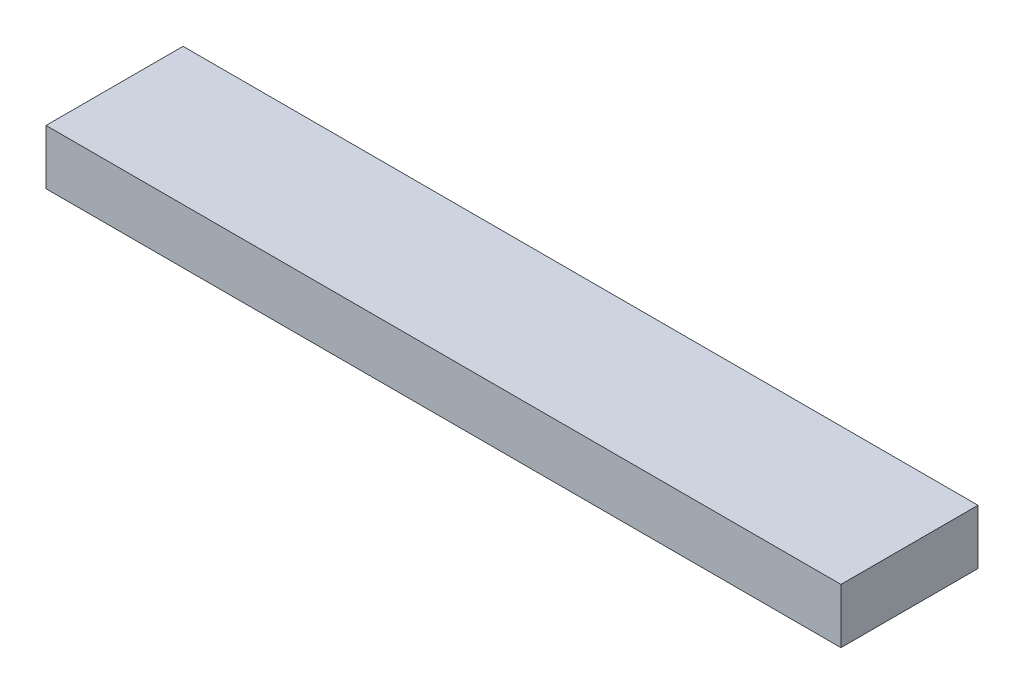
ISO-10303-21;
HEADER;
FILE_DESCRIPTION(('STEP AP214'),'2;1');
FILE_NAME('part.step','',(''),(''),'','','');
FILE_SCHEMA(('AUTOMOTIVE_DESIGN { 1 0 10303 214 1 1 1 1 }'));
ENDSEC;
DATA;
#1=APPLICATION_CONTEXT('core data for automotive mechanical design processes');
#2=APPLICATION_PROTOCOL_DEFINITION('international standard','automotive_design',2000,#1);
#3=PRODUCT_CONTEXT('',#1,'mechanical');
#4=PRODUCT('Part','Part','',(#3));
#5=PRODUCT_RELATED_PRODUCT_CATEGORY('part','',(#4));
#6=PRODUCT_DEFINITION_FORMATION('','',#4);
#7=PRODUCT_DEFINITION_CONTEXT('part definition',#1,'design');
#8=PRODUCT_DEFINITION('design','',#6,#7);
#9=PRODUCT_DEFINITION_SHAPE('','',#8);
#10=(LENGTH_UNIT() NAMED_UNIT(*) SI_UNIT(.MILLI.,.METRE.));
#11=(NAMED_UNIT(*) PLANE_ANGLE_UNIT() SI_UNIT($,.RADIAN.));
#12=(NAMED_UNIT(*) SI_UNIT($,.STERADIAN.) SOLID_ANGLE_UNIT());
#13=UNCERTAINTY_MEASURE_WITH_UNIT(LENGTH_MEASURE(1.E-05),#10,'distance_accuracy_value','');
#14=(GEOMETRIC_REPRESENTATION_CONTEXT(3) GLOBAL_UNCERTAINTY_ASSIGNED_CONTEXT((#13)) GLOBAL_UNIT_ASSIGNED_CONTEXT((#10,
#11,#12)) REPRESENTATION_CONTEXT('',''));
#15=CARTESIAN_POINT('',(0.,0.,0.));
#16=DIRECTION('',(0.,0.,1.));
#17=DIRECTION('',(1.,0.,0.));
#18=AXIS2_PLACEMENT_3D('',#15,#16,#17);
#19=CARTESIAN_POINT('',(0.,10.,0.));
#20=DIRECTION('',(0.,0.,-1.));
#21=DIRECTION('',(-1.,0.,0.));
#22=AXIS2_PLACEMENT_3D('',#19,#20,#21);
#23=PLANE('',#22);
#24=DIRECTION('',(1.,0.,0.));
#25=VECTOR('',#24,1.);
#26=CARTESIAN_POINT('',(0.,0.,0.));
#27=LINE('',#26,#25);
#28=CARTESIAN_POINT('',(0.,0.,0.));
#29=VERTEX_POINT('',#28);
#30=CARTESIAN_POINT('',(145.,0.,0.));
#31=VERTEX_POINT('',#30);
#32=EDGE_CURVE('E98',#29,#31,#27,.T.);
#33=ORIENTED_EDGE('',*,*,#32,.T.);
#34=DIRECTION('',(0.,-1.,0.));
#35=VECTOR('',#34,1.);
#36=CARTESIAN_POINT('',(145.,10.,0.));
#37=LINE('',#36,#35);
#38=CARTESIAN_POINT('',(145.,10.,0.));
#39=VERTEX_POINT('',#38);
#40=EDGE_CURVE('E11',#39,#31,#37,.T.);
#41=ORIENTED_EDGE('',*,*,#40,.F.);
#42=DIRECTION('',(1.,0.,0.));
#43=VECTOR('',#42,1.);
#44=CARTESIAN_POINT('',(0.,10.,0.));
#45=LINE('',#44,#43);
#46=CARTESIAN_POINT('',(0.,10.,0.));
#47=VERTEX_POINT('',#46);
#48=EDGE_CURVE('E84',#47,#39,#45,.T.);
#49=ORIENTED_EDGE('',*,*,#48,.F.);
#50=DIRECTION('',(0.,-1.,0.));
#51=VECTOR('',#50,1.);
#52=CARTESIAN_POINT('',(0.,10.,0.));
#53=LINE('',#52,#51);
#54=EDGE_CURVE('E51',#47,#29,#53,.T.);
#55=ORIENTED_EDGE('',*,*,#54,.T.);
#56=EDGE_LOOP('',(#33,#41,#49,#55));
#57=FACE_BOUND('',#56,.T.);
#58=ADVANCED_FACE('F35',(#57),#23,.F.);
#59=CARTESIAN_POINT('',(145.,10.,0.));
#60=DIRECTION('',(-1.,0.,0.));
#61=DIRECTION('',(0.,0.,1.));
#62=AXIS2_PLACEMENT_3D('',#59,#60,#61);
#63=PLANE('',#62);
#64=DIRECTION('',(0.,0.,-1.));
#65=VECTOR('',#64,1.);
#66=CARTESIAN_POINT('',(145.,0.,0.));
#67=LINE('',#66,#65);
#68=CARTESIAN_POINT('',(145.,0.,-25.));
#69=VERTEX_POINT('',#68);
#70=EDGE_CURVE('E89',#31,#69,#67,.T.);
#71=ORIENTED_EDGE('',*,*,#70,.T.);
#72=DIRECTION('',(0.,-1.,0.));
#73=VECTOR('',#72,1.);
#74=CARTESIAN_POINT('',(145.,10.,-25.));
#75=LINE('',#74,#73);
#76=CARTESIAN_POINT('',(145.,10.,-25.));
#77=VERTEX_POINT('',#76);
#78=EDGE_CURVE('E43',#77,#69,#75,.T.);
#79=ORIENTED_EDGE('',*,*,#78,.F.);
#80=DIRECTION('',(0.,0.,-1.));
#81=VECTOR('',#80,1.);
#82=CARTESIAN_POINT('',(145.,10.,0.));
#83=LINE('',#82,#81);
#84=EDGE_CURVE('E76',#39,#77,#83,.T.);
#85=ORIENTED_EDGE('',*,*,#84,.F.);
#86=ORIENTED_EDGE('',*,*,#40,.T.);
#87=EDGE_LOOP('',(#71,#79,#85,#86));
#88=FACE_BOUND('',#87,.T.);
#89=ADVANCED_FACE('F88',(#88),#63,.F.);
#90=CARTESIAN_POINT('',(0.,10.,-25.));
#91=DIRECTION('',(0.,0.,-1.));
#92=DIRECTION('',(-1.,0.,0.));
#93=AXIS2_PLACEMENT_3D('',#90,#91,#92);
#94=PLANE('',#93);
#95=DIRECTION('',(1.,0.,0.));
#96=VECTOR('',#95,1.);
#97=CARTESIAN_POINT('',(0.,0.,-25.));
#98=LINE('',#97,#96);
#99=CARTESIAN_POINT('',(0.,0.,-25.));
#100=VERTEX_POINT('',#99);
#101=EDGE_CURVE('E101',#100,#69,#98,.T.);
#102=ORIENTED_EDGE('',*,*,#101,.F.);
#103=DIRECTION('',(0.,-1.,0.));
#104=VECTOR('',#103,1.);
#105=CARTESIAN_POINT('',(0.,10.,-25.));
#106=LINE('',#105,#104);
#107=CARTESIAN_POINT('',(0.,10.,-25.));
#108=VERTEX_POINT('',#107);
#109=EDGE_CURVE('E65',#108,#100,#106,.T.);
#110=ORIENTED_EDGE('',*,*,#109,.F.);
#111=DIRECTION('',(1.,0.,0.));
#112=VECTOR('',#111,1.);
#113=CARTESIAN_POINT('',(0.,10.,-25.));
#114=LINE('',#113,#112);
#115=EDGE_CURVE('E83',#108,#77,#114,.T.);
#116=ORIENTED_EDGE('',*,*,#115,.T.);
#117=ORIENTED_EDGE('',*,*,#78,.T.);
#118=EDGE_LOOP('',(#102,#110,#116,#117));
#119=FACE_BOUND('',#118,.T.);
#120=ADVANCED_FACE('F92',(#119),#94,.T.);
#121=CARTESIAN_POINT('',(0.,10.,0.));
#122=DIRECTION('',(-1.,0.,0.));
#123=DIRECTION('',(0.,0.,1.));
#124=AXIS2_PLACEMENT_3D('',#121,#122,#123);
#125=PLANE('',#124);
#126=DIRECTION('',(0.,0.,-1.));
#127=VECTOR('',#126,1.);
#128=CARTESIAN_POINT('',(0.,0.,0.));
#129=LINE('',#128,#127);
#130=EDGE_CURVE('E103',#29,#100,#129,.T.);
#131=ORIENTED_EDGE('',*,*,#130,.F.);
#132=ORIENTED_EDGE('',*,*,#54,.F.);
#133=DIRECTION('',(0.,0.,-1.));
#134=VECTOR('',#133,1.);
#135=CARTESIAN_POINT('',(0.,10.,0.));
#136=LINE('',#135,#134);
#137=EDGE_CURVE('E93',#47,#108,#136,.T.);
#138=ORIENTED_EDGE('',*,*,#137,.T.);
#139=ORIENTED_EDGE('',*,*,#109,.T.);
#140=EDGE_LOOP('',(#131,#132,#138,#139));
#141=FACE_BOUND('',#140,.T.);
#142=ADVANCED_FACE('F109',(#141),#125,.T.);
#143=CARTESIAN_POINT('',(0.,10.,0.));
#144=DIRECTION('',(0.,1.,0.));
#145=DIRECTION('',(0.,0.,1.));
#146=AXIS2_PLACEMENT_3D('',#143,#144,#145);
#147=PLANE('',#146);
#148=ORIENTED_EDGE('',*,*,#48,.T.);
#149=ORIENTED_EDGE('',*,*,#84,.T.);
#150=ORIENTED_EDGE('',*,*,#115,.F.);
#151=ORIENTED_EDGE('',*,*,#137,.F.);
#152=EDGE_LOOP('',(#148,#149,#150,#151));
#153=FACE_BOUND('',#152,.T.);
#154=ADVANCED_FACE('F80',(#153),#147,.T.);
#155=CARTESIAN_POINT('',(0.,0.,0.));
#156=DIRECTION('',(0.,1.,0.));
#157=DIRECTION('',(0.,0.,1.));
#158=AXIS2_PLACEMENT_3D('',#155,#156,#157);
#159=PLANE('',#158);
#160=ORIENTED_EDGE('',*,*,#32,.F.);
#161=ORIENTED_EDGE('',*,*,#130,.T.);
#162=ORIENTED_EDGE('',*,*,#101,.T.);
#163=ORIENTED_EDGE('',*,*,#70,.F.);
#164=EDGE_LOOP('',(#160,#161,#162,#163));
#165=FACE_BOUND('',#164,.T.);
#166=ADVANCED_FACE('F108',(#165),#159,.F.);
#167=CLOSED_SHELL('',(#58,#89,#120,#142,#154,#166));
#168=MANIFOLD_SOLID_BREP('B2',#167);
#169=ADVANCED_BREP_SHAPE_REPRESENTATION('',(#18,#168),#14);
#170=SHAPE_DEFINITION_REPRESENTATION(#9,#169);
ENDSEC;
END-ISO-10303-21;
